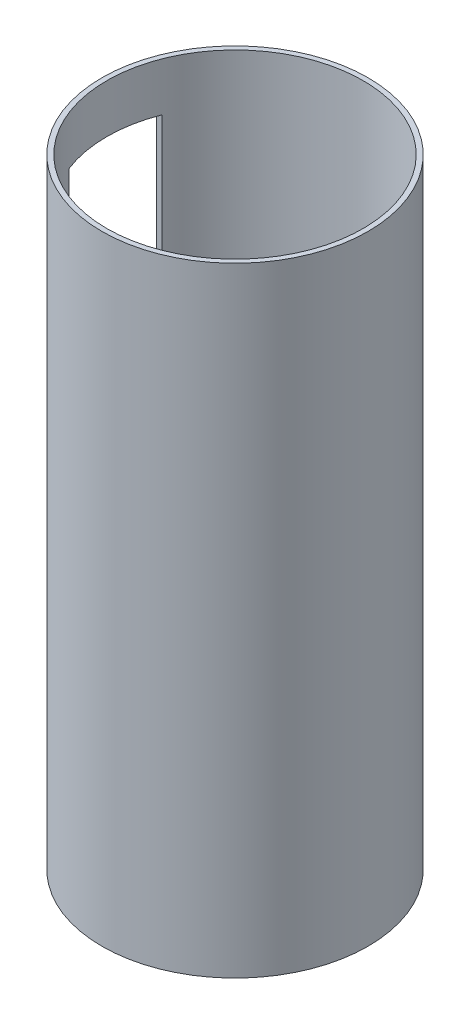
ISO-10303-21;
HEADER;
FILE_DESCRIPTION(('STEP AP214'),'2;1');
FILE_NAME('part.step','',(''),(''),'','','');
FILE_SCHEMA(('AUTOMOTIVE_DESIGN { 1 0 10303 214 1 1 1 1 }'));
ENDSEC;
DATA;
#1=APPLICATION_CONTEXT('core data for automotive mechanical design processes');
#2=APPLICATION_PROTOCOL_DEFINITION('international standard','automotive_design',2000,#1);
#3=PRODUCT_CONTEXT('',#1,'mechanical');
#4=PRODUCT('Part','Part','',(#3));
#5=PRODUCT_RELATED_PRODUCT_CATEGORY('part','',(#4));
#6=PRODUCT_DEFINITION_FORMATION('','',#4);
#7=PRODUCT_DEFINITION_CONTEXT('part definition',#1,'design');
#8=PRODUCT_DEFINITION('design','',#6,#7);
#9=PRODUCT_DEFINITION_SHAPE('','',#8);
#10=(LENGTH_UNIT() NAMED_UNIT(*) SI_UNIT(.MILLI.,.METRE.));
#11=(NAMED_UNIT(*) PLANE_ANGLE_UNIT() SI_UNIT($,.RADIAN.));
#12=(NAMED_UNIT(*) SI_UNIT($,.STERADIAN.) SOLID_ANGLE_UNIT());
#13=UNCERTAINTY_MEASURE_WITH_UNIT(LENGTH_MEASURE(1.E-05),#10,'distance_accuracy_value','');
#14=(GEOMETRIC_REPRESENTATION_CONTEXT(3) GLOBAL_UNCERTAINTY_ASSIGNED_CONTEXT((#13)) GLOBAL_UNIT_ASSIGNED_CONTEXT((#10,
#11,#12)) REPRESENTATION_CONTEXT('',''));
#15=CARTESIAN_POINT('',(0.,0.,0.));
#16=DIRECTION('',(0.,0.,1.));
#17=DIRECTION('',(1.,0.,0.));
#18=AXIS2_PLACEMENT_3D('',#15,#16,#17);
#19=CARTESIAN_POINT('',(0.,100.,0.));
#20=DIRECTION('',(0.,1.,0.));
#21=DIRECTION('',(0.,0.,1.));
#22=AXIS2_PLACEMENT_3D('',#19,#20,#21);
#23=PLANE('',#22);
#24=CARTESIAN_POINT('',(0.,100.,0.));
#25=DIRECTION('',(0.,1.,0.));
#26=DIRECTION('',(0.,0.,1.));
#27=AXIS2_PLACEMENT_3D('',#24,#25,#26);
#28=CIRCLE('',#27,21.5);
#29=CARTESIAN_POINT('',(0.,100.,21.5));
#30=VERTEX_POINT('',#29);
#31=EDGE_CURVE('E102',#30,#30,#28,.T.);
#32=ORIENTED_EDGE('',*,*,#31,.T.);
#33=EDGE_LOOP('',(#32));
#34=FACE_BOUND('',#33,.T.);
#35=CARTESIAN_POINT('',(0.,100.,0.));
#36=DIRECTION('',(0.,1.,0.));
#37=DIRECTION('',(0.,0.,1.));
#38=AXIS2_PLACEMENT_3D('',#35,#36,#37);
#39=CIRCLE('',#38,20.7);
#40=CARTESIAN_POINT('',(0.,100.,20.7));
#41=VERTEX_POINT('',#40);
#42=EDGE_CURVE('E94',#41,#41,#39,.T.);
#43=ORIENTED_EDGE('',*,*,#42,.F.);
#44=EDGE_LOOP('',(#43));
#45=FACE_BOUND('',#44,.T.);
#46=ADVANCED_FACE('F35',(#34,#45),#23,.T.);
#47=CARTESIAN_POINT('',(0.,0.,0.));
#48=DIRECTION('',(0.,1.,0.));
#49=DIRECTION('',(0.,0.,1.));
#50=AXIS2_PLACEMENT_3D('',#47,#48,#49);
#51=PLANE('',#50);
#52=CARTESIAN_POINT('',(0.,0.,0.));
#53=DIRECTION('',(0.,1.,0.));
#54=DIRECTION('',(0.,0.,1.));
#55=AXIS2_PLACEMENT_3D('',#52,#53,#54);
#56=CIRCLE('',#55,21.5);
#57=CARTESIAN_POINT('',(0.,0.,21.5));
#58=VERTEX_POINT('',#57);
#59=EDGE_CURVE('E100',#58,#58,#56,.T.);
#60=ORIENTED_EDGE('',*,*,#59,.F.);
#61=EDGE_LOOP('',(#60));
#62=FACE_BOUND('',#61,.T.);
#63=CARTESIAN_POINT('',(0.,0.,0.));
#64=DIRECTION('',(0.,1.,0.));
#65=DIRECTION('',(0.,0.,1.));
#66=AXIS2_PLACEMENT_3D('',#63,#64,#65);
#67=CIRCLE('',#66,20.7);
#68=CARTESIAN_POINT('',(0.,0.,20.7));
#69=VERTEX_POINT('',#68);
#70=EDGE_CURVE('E91',#69,#69,#67,.T.);
#71=ORIENTED_EDGE('',*,*,#70,.T.);
#72=EDGE_LOOP('',(#71));
#73=FACE_BOUND('',#72,.T.);
#74=ADVANCED_FACE('F134',(#62,#73),#51,.F.);
#75=CARTESIAN_POINT('',(0.,100.,0.));
#76=DIRECTION('',(0.,-1.,0.));
#77=DIRECTION('',(0.,0.,-1.));
#78=AXIS2_PLACEMENT_3D('',#75,#76,#77);
#79=CYLINDRICAL_SURFACE('',#78,21.5);
#80=CARTESIAN_POINT('',(0.,52.1621633133793,0.));
#81=DIRECTION('',(0.,-1.,0.));
#82=DIRECTION('',(0.,0.,-1.));
#83=AXIS2_PLACEMENT_3D('',#80,#81,#82);
#84=CIRCLE('',#83,21.5);
#85=CARTESIAN_POINT('',(-20.1494416796099,52.1621633133793,7.50000000000001));
#86=VERTEX_POINT('',#85);
#87=CARTESIAN_POINT('',(-20.1494416796099,52.1621633133793,-7.49999999999999));
#88=VERTEX_POINT('',#87);
#89=EDGE_CURVE('E90',#86,#88,#84,.T.);
#90=ORIENTED_EDGE('',*,*,#89,.T.);
#91=DIRECTION('',(0.,-1.,0.));
#92=VECTOR('',#91,1.);
#93=CARTESIAN_POINT('',(-20.1494416796099,100.,-7.49999999999998));
#94=LINE('',#93,#92);
#95=CARTESIAN_POINT('',(-20.1494416796099,92.1621633133793,-7.49999999999998));
#96=VERTEX_POINT('',#95);
#97=EDGE_CURVE('E83',#88,#96,#94,.F.);
#98=ORIENTED_EDGE('',*,*,#97,.T.);
#99=CARTESIAN_POINT('',(0.,92.1621633133793,0.));
#100=DIRECTION('',(0.,1.,0.));
#101=DIRECTION('',(0.,0.,1.));
#102=AXIS2_PLACEMENT_3D('',#99,#100,#101);
#103=CIRCLE('',#102,21.5);
#104=CARTESIAN_POINT('',(-20.1494416796099,92.1621633133793,7.50000000000002));
#105=VERTEX_POINT('',#104);
#106=EDGE_CURVE('E72',#96,#105,#103,.T.);
#107=ORIENTED_EDGE('',*,*,#106,.T.);
#108=DIRECTION('',(0.,-1.,0.));
#109=VECTOR('',#108,1.);
#110=CARTESIAN_POINT('',(-20.1494416796099,100.,7.50000000000002));
#111=LINE('',#110,#109);
#112=EDGE_CURVE('E77',#105,#86,#111,.T.);
#113=ORIENTED_EDGE('',*,*,#112,.T.);
#114=EDGE_LOOP('',(#90,#98,#107,#113));
#115=FACE_BOUND('',#114,.T.);
#116=ORIENTED_EDGE('',*,*,#31,.F.);
#117=EDGE_LOOP('',(#116));
#118=FACE_BOUND('',#117,.T.);
#119=ORIENTED_EDGE('',*,*,#59,.T.);
#120=EDGE_LOOP('',(#119));
#121=FACE_BOUND('',#120,.T.);
#122=ADVANCED_FACE('F37',(#115,#118,#121),#79,.T.);
#123=CARTESIAN_POINT('',(0.,100.,0.));
#124=DIRECTION('',(0.,-1.,0.));
#125=DIRECTION('',(0.,0.,-1.));
#126=AXIS2_PLACEMENT_3D('',#123,#124,#125);
#127=CYLINDRICAL_SURFACE('',#126,20.7);
#128=DIRECTION('',(0.,-1.,0.));
#129=VECTOR('',#128,1.);
#130=CARTESIAN_POINT('',(-19.2935222289762,100.,-7.49999999999998));
#131=LINE('',#130,#129);
#132=CARTESIAN_POINT('',(-19.2935222289762,52.1621633133793,-7.49999999999999));
#133=VERTEX_POINT('',#132);
#134=CARTESIAN_POINT('',(-19.2935222289762,92.1621633133793,-7.49999999999998));
#135=VERTEX_POINT('',#134);
#136=EDGE_CURVE('E11',#133,#135,#131,.F.);
#137=ORIENTED_EDGE('',*,*,#136,.F.);
#138=CARTESIAN_POINT('',(0.,52.1621633133793,0.));
#139=DIRECTION('',(0.,-1.,0.));
#140=DIRECTION('',(0.,0.,-1.));
#141=AXIS2_PLACEMENT_3D('',#138,#139,#140);
#142=CIRCLE('',#141,20.7);
#143=CARTESIAN_POINT('',(-19.2935222289762,52.1621633133793,7.50000000000001));
#144=VERTEX_POINT('',#143);
#145=EDGE_CURVE('E43',#144,#133,#142,.T.);
#146=ORIENTED_EDGE('',*,*,#145,.F.);
#147=DIRECTION('',(0.,-1.,0.));
#148=VECTOR('',#147,1.);
#149=CARTESIAN_POINT('',(-19.2935222289762,100.,7.50000000000002));
#150=LINE('',#149,#148);
#151=CARTESIAN_POINT('',(-19.2935222289762,92.1621633133793,7.50000000000002));
#152=VERTEX_POINT('',#151);
#153=EDGE_CURVE('E109',#152,#144,#150,.T.);
#154=ORIENTED_EDGE('',*,*,#153,.F.);
#155=CARTESIAN_POINT('',(0.,92.1621633133793,0.));
#156=DIRECTION('',(0.,1.,0.));
#157=DIRECTION('',(0.,0.,1.));
#158=AXIS2_PLACEMENT_3D('',#155,#156,#157);
#159=CIRCLE('',#158,20.7);
#160=EDGE_CURVE('E105',#135,#152,#159,.T.);
#161=ORIENTED_EDGE('',*,*,#160,.F.);
#162=EDGE_LOOP('',(#137,#146,#154,#161));
#163=FACE_BOUND('',#162,.T.);
#164=ORIENTED_EDGE('',*,*,#42,.T.);
#165=EDGE_LOOP('',(#164));
#166=FACE_BOUND('',#165,.T.);
#167=ORIENTED_EDGE('',*,*,#70,.F.);
#168=EDGE_LOOP('',(#167));
#169=FACE_BOUND('',#168,.T.);
#170=ADVANCED_FACE('F119',(#163,#166,#169),#127,.F.);
#171=CARTESIAN_POINT('',(-100.,92.1621633133793,-7.49999999999998));
#172=DIRECTION('',(0.,0.,-1.));
#173=DIRECTION('',(0.,1.,0.));
#174=AXIS2_PLACEMENT_3D('',#171,#172,#173);
#175=PLANE('',#174);
#176=DIRECTION('',(1.,0.,0.));
#177=VECTOR('',#176,1.);
#178=CARTESIAN_POINT('',(-100.,52.1621633133793,-7.49999999999999));
#179=LINE('',#178,#177);
#180=EDGE_CURVE('E78',#88,#133,#179,.T.);
#181=ORIENTED_EDGE('',*,*,#180,.T.);
#182=ORIENTED_EDGE('',*,*,#136,.T.);
#183=DIRECTION('',(1.,0.,0.));
#184=VECTOR('',#183,1.);
#185=CARTESIAN_POINT('',(-100.,92.1621633133793,-7.49999999999998));
#186=LINE('',#185,#184);
#187=EDGE_CURVE('E55',#96,#135,#186,.T.);
#188=ORIENTED_EDGE('',*,*,#187,.F.);
#189=ORIENTED_EDGE('',*,*,#97,.F.);
#190=EDGE_LOOP('',(#181,#182,#188,#189));
#191=FACE_BOUND('',#190,.T.);
#192=ADVANCED_FACE('F82',(#191),#175,.F.);
#193=CARTESIAN_POINT('',(-100.,52.1621633133793,7.50000000000001));
#194=DIRECTION('',(0.,-1.,0.));
#195=DIRECTION('',(0.,0.,-1.));
#196=AXIS2_PLACEMENT_3D('',#193,#194,#195);
#197=PLANE('',#196);
#198=DIRECTION('',(1.,0.,0.));
#199=VECTOR('',#198,1.);
#200=CARTESIAN_POINT('',(-100.,52.1621633133793,7.50000000000001));
#201=LINE('',#200,#199);
#202=EDGE_CURVE('E115',#86,#144,#201,.T.);
#203=ORIENTED_EDGE('',*,*,#202,.T.);
#204=ORIENTED_EDGE('',*,*,#145,.T.);
#205=ORIENTED_EDGE('',*,*,#180,.F.);
#206=ORIENTED_EDGE('',*,*,#89,.F.);
#207=EDGE_LOOP('',(#203,#204,#205,#206));
#208=FACE_BOUND('',#207,.T.);
#209=ADVANCED_FACE('F113',(#208),#197,.F.);
#210=CARTESIAN_POINT('',(-100.,92.1621633133793,7.50000000000002));
#211=DIRECTION('',(0.,0.,1.));
#212=DIRECTION('',(0.,-1.,0.));
#213=AXIS2_PLACEMENT_3D('',#210,#211,#212);
#214=PLANE('',#213);
#215=DIRECTION('',(1.,0.,0.));
#216=VECTOR('',#215,1.);
#217=CARTESIAN_POINT('',(-100.,92.1621633133793,7.50000000000002));
#218=LINE('',#217,#216);
#219=EDGE_CURVE('E50',#105,#152,#218,.T.);
#220=ORIENTED_EDGE('',*,*,#219,.T.);
#221=ORIENTED_EDGE('',*,*,#153,.T.);
#222=ORIENTED_EDGE('',*,*,#202,.F.);
#223=ORIENTED_EDGE('',*,*,#112,.F.);
#224=EDGE_LOOP('',(#220,#221,#222,#223));
#225=FACE_BOUND('',#224,.T.);
#226=ADVANCED_FACE('F122',(#225),#214,.F.);
#227=CARTESIAN_POINT('',(-100.,92.1621633133793,7.50000000000002));
#228=DIRECTION('',(0.,1.,0.));
#229=DIRECTION('',(0.,0.,1.));
#230=AXIS2_PLACEMENT_3D('',#227,#228,#229);
#231=PLANE('',#230);
#232=ORIENTED_EDGE('',*,*,#187,.T.);
#233=ORIENTED_EDGE('',*,*,#160,.T.);
#234=ORIENTED_EDGE('',*,*,#219,.F.);
#235=ORIENTED_EDGE('',*,*,#106,.F.);
#236=EDGE_LOOP('',(#232,#233,#234,#235));
#237=FACE_BOUND('',#236,.T.);
#238=ADVANCED_FACE('F73',(#237),#231,.F.);
#239=CLOSED_SHELL('',(#46,#74,#122,#170,#192,#209,#226,#238));
#240=MANIFOLD_SOLID_BREP('B2',#239);
#241=ADVANCED_BREP_SHAPE_REPRESENTATION('',(#18,#240),#14);
#242=SHAPE_DEFINITION_REPRESENTATION(#9,#241);
ENDSEC;
END-ISO-10303-21;
